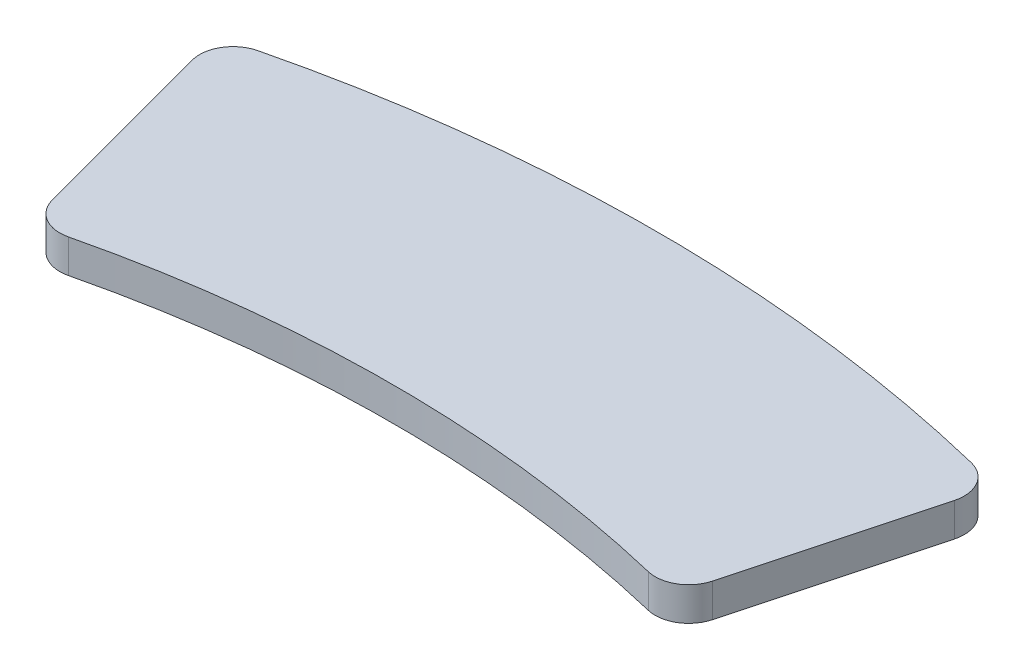
ISO-10303-21;
HEADER;
FILE_DESCRIPTION(('STEP AP214'),'2;1');
FILE_NAME('part.step','',(''),(''),'','','');
FILE_SCHEMA(('AUTOMOTIVE_DESIGN { 1 0 10303 214 1 1 1 1 }'));
ENDSEC;
DATA;
#1=APPLICATION_CONTEXT('core data for automotive mechanical design processes');
#2=APPLICATION_PROTOCOL_DEFINITION('international standard','automotive_design',2000,#1);
#3=PRODUCT_CONTEXT('',#1,'mechanical');
#4=PRODUCT('Part','Part','',(#3));
#5=PRODUCT_RELATED_PRODUCT_CATEGORY('part','',(#4));
#6=PRODUCT_DEFINITION_FORMATION('','',#4);
#7=PRODUCT_DEFINITION_CONTEXT('part definition',#1,'design');
#8=PRODUCT_DEFINITION('design','',#6,#7);
#9=PRODUCT_DEFINITION_SHAPE('','',#8);
#10=(LENGTH_UNIT() NAMED_UNIT(*) SI_UNIT(.MILLI.,.METRE.));
#11=(NAMED_UNIT(*) PLANE_ANGLE_UNIT() SI_UNIT($,.RADIAN.));
#12=(NAMED_UNIT(*) SI_UNIT($,.STERADIAN.) SOLID_ANGLE_UNIT());
#13=UNCERTAINTY_MEASURE_WITH_UNIT(LENGTH_MEASURE(1.E-05),#10,'distance_accuracy_value','');
#14=(GEOMETRIC_REPRESENTATION_CONTEXT(3) GLOBAL_UNCERTAINTY_ASSIGNED_CONTEXT((#13)) GLOBAL_UNIT_ASSIGNED_CONTEXT((#10,
#11,#12)) REPRESENTATION_CONTEXT('',''));
#15=CARTESIAN_POINT('',(0.,0.,0.));
#16=DIRECTION('',(0.,0.,1.));
#17=DIRECTION('',(1.,0.,0.));
#18=AXIS2_PLACEMENT_3D('',#15,#16,#17);
#19=CARTESIAN_POINT('',(0.,2.,0.));
#20=DIRECTION('',(0.,-1.,0.));
#21=DIRECTION('',(0.,0.,-1.));
#22=AXIS2_PLACEMENT_3D('',#19,#20,#21);
#23=CYLINDRICAL_SURFACE('',#22,90.);
#24=CARTESIAN_POINT('',(0.,0.,0.));
#25=DIRECTION('',(0.,1.,0.));
#26=DIRECTION('',(0.,0.,1.));
#27=AXIS2_PLACEMENT_3D('',#24,#25,#26);
#28=CIRCLE('',#27,90.);
#29=CARTESIAN_POINT('',(21.3119399716708,0.,-87.4402722699552));
#30=VERTEX_POINT('',#29);
#31=CARTESIAN_POINT('',(-21.3119399716708,0.,-87.4402722699552));
#32=VERTEX_POINT('',#31);
#33=EDGE_CURVE('E134',#30,#32,#28,.T.);
#34=ORIENTED_EDGE('',*,*,#33,.T.);
#35=DIRECTION('',(0.,-1.,0.));
#36=VECTOR('',#35,1.);
#37=CARTESIAN_POINT('',(-21.3119399716708,2.,-87.4402722699552));
#38=LINE('',#37,#36);
#39=CARTESIAN_POINT('',(-21.3119399716708,2.,-87.4402722699552));
#40=VERTEX_POINT('',#39);
#41=EDGE_CURVE('E157',#32,#40,#38,.F.);
#42=ORIENTED_EDGE('',*,*,#41,.T.);
#43=CARTESIAN_POINT('',(0.,2.,0.));
#44=DIRECTION('',(0.,1.,0.));
#45=DIRECTION('',(0.,0.,1.));
#46=AXIS2_PLACEMENT_3D('',#43,#44,#45);
#47=CIRCLE('',#46,90.);
#48=CARTESIAN_POINT('',(21.3119399716708,2.,-87.4402722699552));
#49=VERTEX_POINT('',#48);
#50=EDGE_CURVE('E132',#49,#40,#47,.T.);
#51=ORIENTED_EDGE('',*,*,#50,.F.);
#52=DIRECTION('',(0.,-1.,0.));
#53=VECTOR('',#52,1.);
#54=CARTESIAN_POINT('',(21.3119399716708,2.,-87.4402722699552));
#55=LINE('',#54,#53);
#56=EDGE_CURVE('E154',#49,#30,#55,.T.);
#57=ORIENTED_EDGE('',*,*,#56,.T.);
#58=EDGE_LOOP('',(#34,#42,#51,#57));
#59=FACE_BOUND('',#58,.T.);
#60=ADVANCED_FACE('F39',(#59),#23,.T.);
#61=CARTESIAN_POINT('',(-23.2937140592263,2.,-86.9333243660163));
#62=DIRECTION('',(0.96592582628907,0.,-0.258819045102514));
#63=DIRECTION('',(-0.258819045102514,0.,-0.96592582628907));
#64=AXIS2_PLACEMENT_3D('',#61,#62,#63);
#65=PLANE('',#64);
#66=DIRECTION('',(0.258819045102514,0.,0.96592582628907));
#67=VECTOR('',#66,1.);
#68=CARTESIAN_POINT('',(-23.2937140592263,0.,-86.9333243660163));
#69=LINE('',#68,#67);
#70=CARTESIAN_POINT('',(-22.7701929582118,0.,-84.9795170181956));
#71=VERTEX_POINT('',#70);
#72=CARTESIAN_POINT('',(-19.7152169156845,0.,-73.5781912115778));
#73=VERTEX_POINT('',#72);
#74=EDGE_CURVE('E130',#71,#73,#69,.T.);
#75=ORIENTED_EDGE('',*,*,#74,.T.);
#76=DIRECTION('',(0.,-1.,0.));
#77=VECTOR('',#76,1.);
#78=CARTESIAN_POINT('',(-19.7152169156845,2.,-73.5781912115778));
#79=LINE('',#78,#77);
#80=CARTESIAN_POINT('',(-19.7152169156845,2.,-73.5781912115778));
#81=VERTEX_POINT('',#80);
#82=EDGE_CURVE('E109',#73,#81,#79,.F.);
#83=ORIENTED_EDGE('',*,*,#82,.T.);
#84=DIRECTION('',(0.258819045102514,0.,0.96592582628907));
#85=VECTOR('',#84,1.);
#86=CARTESIAN_POINT('',(-23.2937140592263,2.,-86.9333243660163));
#87=LINE('',#86,#85);
#88=CARTESIAN_POINT('',(-22.7701929582118,2.,-84.9795170181956));
#89=VERTEX_POINT('',#88);
#90=EDGE_CURVE('E173',#89,#81,#87,.T.);
#91=ORIENTED_EDGE('',*,*,#90,.F.);
#92=DIRECTION('',(0.,-1.,0.));
#93=VECTOR('',#92,1.);
#94=CARTESIAN_POINT('',(-22.7701929582118,2.,-84.9795170181956));
#95=LINE('',#94,#93);
#96=EDGE_CURVE('E114',#89,#71,#95,.T.);
#97=ORIENTED_EDGE('',*,*,#96,.T.);
#98=EDGE_LOOP('',(#75,#83,#91,#97));
#99=FACE_BOUND('',#98,.T.);
#100=ADVANCED_FACE('F190',(#99),#65,.F.);
#101=CARTESIAN_POINT('',(0.,2.,0.));
#102=DIRECTION('',(0.,-1.,0.));
#103=DIRECTION('',(0.,0.,-1.));
#104=AXIS2_PLACEMENT_3D('',#101,#102,#103);
#105=CYLINDRICAL_SURFACE('',#104,74.2);
#106=CARTESIAN_POINT('',(0.,2.,0.));
#107=DIRECTION('',(0.,-1.,0.));
#108=DIRECTION('',(0.,0.,1.));
#109=AXIS2_PLACEMENT_3D('',#106,#107,#108);
#110=CIRCLE('',#109,74.2);
#111=CARTESIAN_POINT('',(-17.316610269324,2.,-72.1510568791638));
#112=VERTEX_POINT('',#111);
#113=CARTESIAN_POINT('',(17.3166102693241,2.,-72.1510568791638));
#114=VERTEX_POINT('',#113);
#115=EDGE_CURVE('E123',#112,#114,#110,.T.);
#116=ORIENTED_EDGE('',*,*,#115,.F.);
#117=DIRECTION('',(0.,-1.,0.));
#118=VECTOR('',#117,1.);
#119=CARTESIAN_POINT('',(-17.316610269324,2.,-72.1510568791638));
#120=LINE('',#119,#118);
#121=CARTESIAN_POINT('',(-17.316610269324,0.,-72.1510568791638));
#122=VERTEX_POINT('',#121);
#123=EDGE_CURVE('E108',#112,#122,#120,.T.);
#124=ORIENTED_EDGE('',*,*,#123,.T.);
#125=CARTESIAN_POINT('',(0.,0.,0.));
#126=DIRECTION('',(0.,-1.,0.));
#127=DIRECTION('',(0.,0.,1.));
#128=AXIS2_PLACEMENT_3D('',#125,#126,#127);
#129=CIRCLE('',#128,74.2);
#130=CARTESIAN_POINT('',(17.3166102693241,0.,-72.1510568791638));
#131=VERTEX_POINT('',#130);
#132=EDGE_CURVE('E121',#122,#131,#129,.T.);
#133=ORIENTED_EDGE('',*,*,#132,.T.);
#134=DIRECTION('',(0.,-1.,0.));
#135=VECTOR('',#134,1.);
#136=CARTESIAN_POINT('',(17.3166102693241,2.,-72.1510568791638));
#137=LINE('',#136,#135);
#138=EDGE_CURVE('E125',#131,#114,#137,.F.);
#139=ORIENTED_EDGE('',*,*,#138,.T.);
#140=EDGE_LOOP('',(#116,#124,#133,#139));
#141=FACE_BOUND('',#140,.T.);
#142=ADVANCED_FACE('F120',(#141),#105,.F.);
#143=CARTESIAN_POINT('',(23.2937140592263,2.,-86.9333243660162));
#144=DIRECTION('',(-0.96592582628907,0.,-0.258819045102514));
#145=DIRECTION('',(-0.258819045102514,0.,0.96592582628907));
#146=AXIS2_PLACEMENT_3D('',#143,#144,#145);
#147=PLANE('',#146);
#148=DIRECTION('',(0.258819045102514,0.,-0.96592582628907));
#149=VECTOR('',#148,1.);
#150=CARTESIAN_POINT('',(23.2937140592263,0.,-86.9333243660162));
#151=LINE('',#150,#149);
#152=CARTESIAN_POINT('',(19.7152169156845,0.,-73.5781912115778));
#153=VERTEX_POINT('',#152);
#154=CARTESIAN_POINT('',(22.7701929582118,0.,-84.9795170181956));
#155=VERTEX_POINT('',#154);
#156=EDGE_CURVE('E129',#153,#155,#151,.T.);
#157=ORIENTED_EDGE('',*,*,#156,.T.);
#158=DIRECTION('',(0.,-1.,0.));
#159=VECTOR('',#158,1.);
#160=CARTESIAN_POINT('',(22.7701929582118,2.,-84.9795170181956));
#161=LINE('',#160,#159);
#162=CARTESIAN_POINT('',(22.7701929582118,2.,-84.9795170181956));
#163=VERTEX_POINT('',#162);
#164=EDGE_CURVE('E11',#155,#163,#161,.F.);
#165=ORIENTED_EDGE('',*,*,#164,.T.);
#166=DIRECTION('',(0.258819045102514,0.,-0.96592582628907));
#167=VECTOR('',#166,1.);
#168=CARTESIAN_POINT('',(23.2937140592263,2.,-86.9333243660162));
#169=LINE('',#168,#167);
#170=CARTESIAN_POINT('',(19.7152169156845,2.,-73.5781912115778));
#171=VERTEX_POINT('',#170);
#172=EDGE_CURVE('E138',#171,#163,#169,.T.);
#173=ORIENTED_EDGE('',*,*,#172,.F.);
#174=DIRECTION('',(0.,-1.,0.));
#175=VECTOR('',#174,1.);
#176=CARTESIAN_POINT('',(19.7152169156845,2.,-73.5781912115778));
#177=LINE('',#176,#175);
#178=EDGE_CURVE('E47',#171,#153,#177,.T.);
#179=ORIENTED_EDGE('',*,*,#178,.T.);
#180=EDGE_LOOP('',(#157,#165,#173,#179));
#181=FACE_BOUND('',#180,.T.);
#182=ADVANCED_FACE('F160',(#181),#147,.F.);
#183=CARTESIAN_POINT('',(0.,2.,0.));
#184=DIRECTION('',(0.,1.,0.));
#185=DIRECTION('',(0.,0.,1.));
#186=AXIS2_PLACEMENT_3D('',#183,#184,#185);
#187=PLANE('',#186);
#188=ORIENTED_EDGE('',*,*,#90,.T.);
#189=CARTESIAN_POINT('',(-17.7833652631064,2.,-74.0958293017828));
#190=DIRECTION('',(0.,1.,0.));
#191=DIRECTION('',(0.,0.,1.));
#192=AXIS2_PLACEMENT_3D('',#189,#190,#191);
#193=CIRCLE('',#192,2.);
#194=EDGE_CURVE('E152',#81,#112,#193,.T.);
#195=ORIENTED_EDGE('',*,*,#194,.T.);
#196=ORIENTED_EDGE('',*,*,#115,.T.);
#197=CARTESIAN_POINT('',(17.7833652631064,2.,-74.0958293017828));
#198=DIRECTION('',(0.,1.,0.));
#199=DIRECTION('',(0.,0.,1.));
#200=AXIS2_PLACEMENT_3D('',#197,#198,#199);
#201=CIRCLE('',#200,2.);
#202=EDGE_CURVE('E59',#114,#171,#201,.T.);
#203=ORIENTED_EDGE('',*,*,#202,.T.);
#204=ORIENTED_EDGE('',*,*,#172,.T.);
#205=CARTESIAN_POINT('',(20.8383413056337,2.,-85.4971551084006));
#206=DIRECTION('',(0.,1.,0.));
#207=DIRECTION('',(0.,0.,1.));
#208=AXIS2_PLACEMENT_3D('',#205,#206,#207);
#209=CIRCLE('',#208,2.);
#210=EDGE_CURVE('E148',#163,#49,#209,.T.);
#211=ORIENTED_EDGE('',*,*,#210,.T.);
#212=ORIENTED_EDGE('',*,*,#50,.T.);
#213=CARTESIAN_POINT('',(-20.8383413056336,2.,-85.4971551084006));
#214=DIRECTION('',(0.,1.,0.));
#215=DIRECTION('',(0.,0.,1.));
#216=AXIS2_PLACEMENT_3D('',#213,#214,#215);
#217=CIRCLE('',#216,2.);
#218=EDGE_CURVE('E150',#40,#89,#217,.T.);
#219=ORIENTED_EDGE('',*,*,#218,.T.);
#220=EDGE_LOOP('',(#188,#195,#196,#203,#204,#211,#212,#219));
#221=FACE_BOUND('',#220,.T.);
#222=ADVANCED_FACE('F179',(#221),#187,.T.);
#223=CARTESIAN_POINT('',(0.,0.,0.));
#224=DIRECTION('',(0.,1.,0.));
#225=DIRECTION('',(0.,0.,1.));
#226=AXIS2_PLACEMENT_3D('',#223,#224,#225);
#227=PLANE('',#226);
#228=ORIENTED_EDGE('',*,*,#132,.F.);
#229=CARTESIAN_POINT('',(-17.7833652631064,0.,-74.0958293017828));
#230=DIRECTION('',(0.,1.,0.));
#231=DIRECTION('',(0.,0.,1.));
#232=AXIS2_PLACEMENT_3D('',#229,#230,#231);
#233=CIRCLE('',#232,2.);
#234=EDGE_CURVE('E104',#122,#73,#233,.F.);
#235=ORIENTED_EDGE('',*,*,#234,.T.);
#236=ORIENTED_EDGE('',*,*,#74,.F.);
#237=CARTESIAN_POINT('',(-20.8383413056336,0.,-85.4971551084006));
#238=DIRECTION('',(0.,1.,0.));
#239=DIRECTION('',(0.,0.,1.));
#240=AXIS2_PLACEMENT_3D('',#237,#238,#239);
#241=CIRCLE('',#240,2.);
#242=EDGE_CURVE('E115',#71,#32,#241,.F.);
#243=ORIENTED_EDGE('',*,*,#242,.T.);
#244=ORIENTED_EDGE('',*,*,#33,.F.);
#245=CARTESIAN_POINT('',(20.8383413056337,0.,-85.4971551084006));
#246=DIRECTION('',(0.,1.,0.));
#247=DIRECTION('',(0.,0.,1.));
#248=AXIS2_PLACEMENT_3D('',#245,#246,#247);
#249=CIRCLE('',#248,2.);
#250=EDGE_CURVE('E141',#30,#155,#249,.F.);
#251=ORIENTED_EDGE('',*,*,#250,.T.);
#252=ORIENTED_EDGE('',*,*,#156,.F.);
#253=CARTESIAN_POINT('',(17.7833652631064,0.,-74.0958293017828));
#254=DIRECTION('',(0.,1.,0.));
#255=DIRECTION('',(0.,0.,1.));
#256=AXIS2_PLACEMENT_3D('',#253,#254,#255);
#257=CIRCLE('',#256,2.);
#258=EDGE_CURVE('E124',#153,#131,#257,.F.);
#259=ORIENTED_EDGE('',*,*,#258,.T.);
#260=EDGE_LOOP('',(#228,#235,#236,#243,#244,#251,#252,#259));
#261=FACE_BOUND('',#260,.T.);
#262=ADVANCED_FACE('F127',(#261),#227,.F.);
#263=CARTESIAN_POINT('',(-17.7833652631064,2.,-74.0958293017828));
#264=DIRECTION('',(0.,-1.,0.));
#265=DIRECTION('',(0.,0.,-1.));
#266=AXIS2_PLACEMENT_3D('',#263,#264,#265);
#267=CYLINDRICAL_SURFACE('',#266,2.);
#268=ORIENTED_EDGE('',*,*,#194,.F.);
#269=ORIENTED_EDGE('',*,*,#82,.F.);
#270=ORIENTED_EDGE('',*,*,#234,.F.);
#271=ORIENTED_EDGE('',*,*,#123,.F.);
#272=EDGE_LOOP('',(#268,#269,#270,#271));
#273=FACE_BOUND('',#272,.T.);
#274=ADVANCED_FACE('F107',(#273),#267,.T.);
#275=CARTESIAN_POINT('',(-20.8383413056336,2.,-85.4971551084006));
#276=DIRECTION('',(0.,-1.,0.));
#277=DIRECTION('',(0.,0.,-1.));
#278=AXIS2_PLACEMENT_3D('',#275,#276,#277);
#279=CYLINDRICAL_SURFACE('',#278,2.);
#280=ORIENTED_EDGE('',*,*,#218,.F.);
#281=ORIENTED_EDGE('',*,*,#41,.F.);
#282=ORIENTED_EDGE('',*,*,#242,.F.);
#283=ORIENTED_EDGE('',*,*,#96,.F.);
#284=EDGE_LOOP('',(#280,#281,#282,#283));
#285=FACE_BOUND('',#284,.T.);
#286=ADVANCED_FACE('F201',(#285),#279,.T.);
#287=CARTESIAN_POINT('',(20.8383413056337,2.,-85.4971551084006));
#288=DIRECTION('',(0.,-1.,0.));
#289=DIRECTION('',(0.,0.,-1.));
#290=AXIS2_PLACEMENT_3D('',#287,#288,#289);
#291=CYLINDRICAL_SURFACE('',#290,2.);
#292=ORIENTED_EDGE('',*,*,#210,.F.);
#293=ORIENTED_EDGE('',*,*,#164,.F.);
#294=ORIENTED_EDGE('',*,*,#250,.F.);
#295=ORIENTED_EDGE('',*,*,#56,.F.);
#296=EDGE_LOOP('',(#292,#293,#294,#295));
#297=FACE_BOUND('',#296,.T.);
#298=ADVANCED_FACE('F167',(#297),#291,.T.);
#299=CARTESIAN_POINT('',(17.7833652631064,2.,-74.0958293017828));
#300=DIRECTION('',(0.,-1.,0.));
#301=DIRECTION('',(0.,0.,-1.));
#302=AXIS2_PLACEMENT_3D('',#299,#300,#301);
#303=CYLINDRICAL_SURFACE('',#302,2.);
#304=ORIENTED_EDGE('',*,*,#202,.F.);
#305=ORIENTED_EDGE('',*,*,#138,.F.);
#306=ORIENTED_EDGE('',*,*,#258,.F.);
#307=ORIENTED_EDGE('',*,*,#178,.F.);
#308=EDGE_LOOP('',(#304,#305,#306,#307));
#309=FACE_BOUND('',#308,.T.);
#310=ADVANCED_FACE('F41',(#309),#303,.T.);
#311=CLOSED_SHELL('',(#60,#100,#142,#182,#222,#262,#274,#286,#298,#310));
#312=MANIFOLD_SOLID_BREP('B2',#311);
#313=ADVANCED_BREP_SHAPE_REPRESENTATION('',(#18,#312),#14);
#314=SHAPE_DEFINITION_REPRESENTATION(#9,#313);
ENDSEC;
END-ISO-10303-21;
